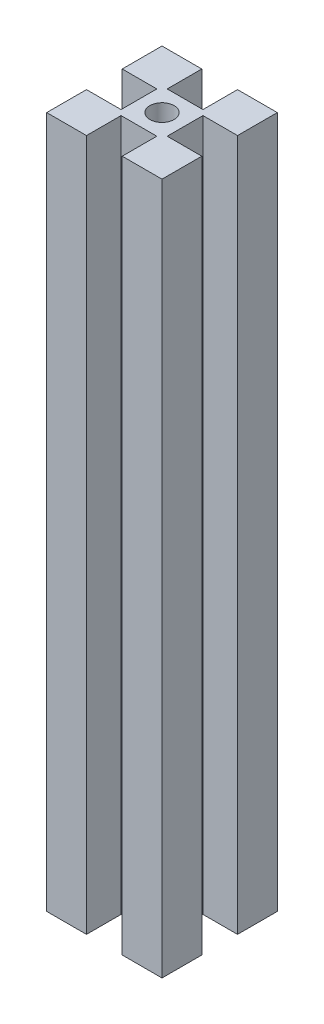
ISO-10303-21;
HEADER;
FILE_DESCRIPTION(('STEP AP214'),'2;1');
FILE_NAME('part.step','',(''),(''),'','','');
FILE_SCHEMA(('AUTOMOTIVE_DESIGN { 1 0 10303 214 1 1 1 1 }'));
ENDSEC;
DATA;
#1=APPLICATION_CONTEXT('core data for automotive mechanical design processes');
#2=APPLICATION_PROTOCOL_DEFINITION('international standard','automotive_design',2000,#1);
#3=PRODUCT_CONTEXT('',#1,'mechanical');
#4=PRODUCT('Part','Part','',(#3));
#5=PRODUCT_RELATED_PRODUCT_CATEGORY('part','',(#4));
#6=PRODUCT_DEFINITION_FORMATION('','',#4);
#7=PRODUCT_DEFINITION_CONTEXT('part definition',#1,'design');
#8=PRODUCT_DEFINITION('design','',#6,#7);
#9=PRODUCT_DEFINITION_SHAPE('','',#8);
#10=(LENGTH_UNIT() NAMED_UNIT(*) SI_UNIT(.MILLI.,.METRE.));
#11=(NAMED_UNIT(*) PLANE_ANGLE_UNIT() SI_UNIT($,.RADIAN.));
#12=(NAMED_UNIT(*) SI_UNIT($,.STERADIAN.) SOLID_ANGLE_UNIT());
#13=UNCERTAINTY_MEASURE_WITH_UNIT(LENGTH_MEASURE(1.E-05),#10,'distance_accuracy_value','');
#14=(GEOMETRIC_REPRESENTATION_CONTEXT(3) GLOBAL_UNCERTAINTY_ASSIGNED_CONTEXT((#13)) GLOBAL_UNIT_ASSIGNED_CONTEXT((#10,
#11,#12)) REPRESENTATION_CONTEXT('',''));
#15=CARTESIAN_POINT('',(0.,0.,0.));
#16=DIRECTION('',(0.,0.,1.));
#17=DIRECTION('',(1.,0.,0.));
#18=AXIS2_PLACEMENT_3D('',#15,#16,#17);
#19=CARTESIAN_POINT('',(0.,120.,0.));
#20=DIRECTION('',(0.,1.,0.));
#21=DIRECTION('',(0.,0.,1.));
#22=AXIS2_PLACEMENT_3D('',#19,#20,#21);
#23=PLANE('',#22);
#24=DIRECTION('',(1.,0.,0.));
#25=VECTOR('',#24,1.);
#26=CARTESIAN_POINT('',(3.1,120.,10.));
#27=LINE('',#26,#25);
#28=CARTESIAN_POINT('',(3.1,120.,10.));
#29=VERTEX_POINT('',#28);
#30=CARTESIAN_POINT('',(10.,120.,10.));
#31=VERTEX_POINT('',#30);
#32=EDGE_CURVE('E252',#29,#31,#27,.T.);
#33=ORIENTED_EDGE('',*,*,#32,.T.);
#34=DIRECTION('',(0.,0.,-1.));
#35=VECTOR('',#34,1.);
#36=CARTESIAN_POINT('',(10.,120.,10.));
#37=LINE('',#36,#35);
#38=CARTESIAN_POINT('',(10.,120.,3.1));
#39=VERTEX_POINT('',#38);
#40=EDGE_CURVE('E137',#31,#39,#37,.T.);
#41=ORIENTED_EDGE('',*,*,#40,.T.);
#42=DIRECTION('',(-1.,0.,0.));
#43=VECTOR('',#42,1.);
#44=CARTESIAN_POINT('',(10.,120.,3.1));
#45=LINE('',#44,#43);
#46=CARTESIAN_POINT('',(4.,120.,3.1));
#47=VERTEX_POINT('',#46);
#48=EDGE_CURVE('E302',#39,#47,#45,.T.);
#49=ORIENTED_EDGE('',*,*,#48,.T.);
#50=DIRECTION('',(0.,0.,-1.));
#51=VECTOR('',#50,1.);
#52=CARTESIAN_POINT('',(4.,120.,3.1));
#53=LINE('',#52,#51);
#54=CARTESIAN_POINT('',(4.,120.,-3.1));
#55=VERTEX_POINT('',#54);
#56=EDGE_CURVE('E321',#47,#55,#53,.T.);
#57=ORIENTED_EDGE('',*,*,#56,.T.);
#58=DIRECTION('',(1.,0.,0.));
#59=VECTOR('',#58,1.);
#60=CARTESIAN_POINT('',(4.,120.,-3.1));
#61=LINE('',#60,#59);
#62=CARTESIAN_POINT('',(10.,120.,-3.1));
#63=VERTEX_POINT('',#62);
#64=EDGE_CURVE('E318',#55,#63,#61,.T.);
#65=ORIENTED_EDGE('',*,*,#64,.T.);
#66=DIRECTION('',(0.,0.,-1.));
#67=VECTOR('',#66,1.);
#68=CARTESIAN_POINT('',(10.,120.,-3.1));
#69=LINE('',#68,#67);
#70=CARTESIAN_POINT('',(10.,120.,-10.));
#71=VERTEX_POINT('',#70);
#72=EDGE_CURVE('E319',#63,#71,#69,.T.);
#73=ORIENTED_EDGE('',*,*,#72,.T.);
#74=DIRECTION('',(-1.,0.,0.));
#75=VECTOR('',#74,1.);
#76=CARTESIAN_POINT('',(10.,120.,-10.));
#77=LINE('',#76,#75);
#78=CARTESIAN_POINT('',(3.1,120.,-10.));
#79=VERTEX_POINT('',#78);
#80=EDGE_CURVE('E322',#71,#79,#77,.T.);
#81=ORIENTED_EDGE('',*,*,#80,.T.);
#82=DIRECTION('',(0.,0.,1.));
#83=VECTOR('',#82,1.);
#84=CARTESIAN_POINT('',(3.1,120.,-10.));
#85=LINE('',#84,#83);
#86=CARTESIAN_POINT('',(3.1,120.,-4.));
#87=VERTEX_POINT('',#86);
#88=EDGE_CURVE('E326',#79,#87,#85,.T.);
#89=ORIENTED_EDGE('',*,*,#88,.T.);
#90=DIRECTION('',(-1.,0.,0.));
#91=VECTOR('',#90,1.);
#92=CARTESIAN_POINT('',(3.1,120.,-4.));
#93=LINE('',#92,#91);
#94=CARTESIAN_POINT('',(-3.1,120.,-4.));
#95=VERTEX_POINT('',#94);
#96=EDGE_CURVE('E332',#87,#95,#93,.T.);
#97=ORIENTED_EDGE('',*,*,#96,.T.);
#98=DIRECTION('',(0.,0.,-1.));
#99=VECTOR('',#98,1.);
#100=CARTESIAN_POINT('',(-3.1,120.,-4.));
#101=LINE('',#100,#99);
#102=CARTESIAN_POINT('',(-3.1,120.,-10.));
#103=VERTEX_POINT('',#102);
#104=EDGE_CURVE('E335',#95,#103,#101,.T.);
#105=ORIENTED_EDGE('',*,*,#104,.T.);
#106=DIRECTION('',(-1.,0.,0.));
#107=VECTOR('',#106,1.);
#108=CARTESIAN_POINT('',(-3.1,120.,-10.));
#109=LINE('',#108,#107);
#110=CARTESIAN_POINT('',(-10.,120.,-10.));
#111=VERTEX_POINT('',#110);
#112=EDGE_CURVE('E333',#103,#111,#109,.T.);
#113=ORIENTED_EDGE('',*,*,#112,.T.);
#114=DIRECTION('',(0.,0.,1.));
#115=VECTOR('',#114,1.);
#116=CARTESIAN_POINT('',(-10.,120.,-10.));
#117=LINE('',#116,#115);
#118=CARTESIAN_POINT('',(-10.,120.,-3.1));
#119=VERTEX_POINT('',#118);
#120=EDGE_CURVE('E340',#111,#119,#117,.T.);
#121=ORIENTED_EDGE('',*,*,#120,.T.);
#122=DIRECTION('',(1.,0.,0.));
#123=VECTOR('',#122,1.);
#124=CARTESIAN_POINT('',(-10.,120.,-3.1));
#125=LINE('',#124,#123);
#126=CARTESIAN_POINT('',(-4.,120.,-3.1));
#127=VERTEX_POINT('',#126);
#128=EDGE_CURVE('E339',#119,#127,#125,.T.);
#129=ORIENTED_EDGE('',*,*,#128,.T.);
#130=DIRECTION('',(0.,0.,1.));
#131=VECTOR('',#130,1.);
#132=CARTESIAN_POINT('',(-4.,120.,-3.1));
#133=LINE('',#132,#131);
#134=CARTESIAN_POINT('',(-4.,120.,3.1));
#135=VERTEX_POINT('',#134);
#136=EDGE_CURVE('E342',#127,#135,#133,.T.);
#137=ORIENTED_EDGE('',*,*,#136,.T.);
#138=DIRECTION('',(-1.,0.,0.));
#139=VECTOR('',#138,1.);
#140=CARTESIAN_POINT('',(-4.,120.,3.1));
#141=LINE('',#140,#139);
#142=CARTESIAN_POINT('',(-10.,120.,3.1));
#143=VERTEX_POINT('',#142);
#144=EDGE_CURVE('E345',#135,#143,#141,.T.);
#145=ORIENTED_EDGE('',*,*,#144,.T.);
#146=DIRECTION('',(0.,0.,1.));
#147=VECTOR('',#146,1.);
#148=CARTESIAN_POINT('',(-10.,120.,3.1));
#149=LINE('',#148,#147);
#150=CARTESIAN_POINT('',(-10.,120.,10.));
#151=VERTEX_POINT('',#150);
#152=EDGE_CURVE('E343',#143,#151,#149,.T.);
#153=ORIENTED_EDGE('',*,*,#152,.T.);
#154=DIRECTION('',(1.,0.,0.));
#155=VECTOR('',#154,1.);
#156=CARTESIAN_POINT('',(-10.,120.,10.));
#157=LINE('',#156,#155);
#158=CARTESIAN_POINT('',(-3.1,120.,10.));
#159=VERTEX_POINT('',#158);
#160=EDGE_CURVE('E191',#151,#159,#157,.T.);
#161=ORIENTED_EDGE('',*,*,#160,.T.);
#162=DIRECTION('',(0.,0.,-1.));
#163=VECTOR('',#162,1.);
#164=CARTESIAN_POINT('',(-3.1,120.,10.));
#165=LINE('',#164,#163);
#166=CARTESIAN_POINT('',(-3.1,120.,4.));
#167=VERTEX_POINT('',#166);
#168=EDGE_CURVE('E187',#159,#167,#165,.T.);
#169=ORIENTED_EDGE('',*,*,#168,.T.);
#170=DIRECTION('',(1.,0.,0.));
#171=VECTOR('',#170,1.);
#172=CARTESIAN_POINT('',(-3.1,120.,4.));
#173=LINE('',#172,#171);
#174=CARTESIAN_POINT('',(3.1,120.,4.));
#175=VERTEX_POINT('',#174);
#176=EDGE_CURVE('E195',#167,#175,#173,.T.);
#177=ORIENTED_EDGE('',*,*,#176,.T.);
#178=DIRECTION('',(0.,0.,1.));
#179=VECTOR('',#178,1.);
#180=CARTESIAN_POINT('',(3.1,120.,4.));
#181=LINE('',#180,#179);
#182=EDGE_CURVE('E58',#175,#29,#181,.T.);
#183=ORIENTED_EDGE('',*,*,#182,.T.);
#184=EDGE_LOOP('',(#33,#41,#49,#57,#65,#73,#81,#89,#97,#105,#113,#121,#129,#137,#145,#153,#161,
#169,#177,#183));
#185=FACE_BOUND('',#184,.T.);
#186=CARTESIAN_POINT('',(0.,120.,0.));
#187=DIRECTION('',(0.,1.,0.));
#188=DIRECTION('',(0.,0.,1.));
#189=AXIS2_PLACEMENT_3D('',#186,#187,#188);
#190=CIRCLE('',#189,2.1);
#191=CARTESIAN_POINT('',(0.,120.,2.1));
#192=VERTEX_POINT('',#191);
#193=EDGE_CURVE('E218',#192,#192,#190,.T.);
#194=ORIENTED_EDGE('',*,*,#193,.F.);
#195=EDGE_LOOP('',(#194));
#196=FACE_BOUND('',#195,.T.);
#197=ADVANCED_FACE('F43',(#185,#196),#23,.T.);
#198=CARTESIAN_POINT('',(0.,0.,0.));
#199=DIRECTION('',(0.,1.,0.));
#200=DIRECTION('',(0.,0.,1.));
#201=AXIS2_PLACEMENT_3D('',#198,#199,#200);
#202=PLANE('',#201);
#203=DIRECTION('',(1.,0.,0.));
#204=VECTOR('',#203,1.);
#205=CARTESIAN_POINT('',(3.1,0.,10.));
#206=LINE('',#205,#204);
#207=CARTESIAN_POINT('',(3.1,0.,10.));
#208=VERTEX_POINT('',#207);
#209=CARTESIAN_POINT('',(10.,0.,10.));
#210=VERTEX_POINT('',#209);
#211=EDGE_CURVE('E212',#208,#210,#206,.T.);
#212=ORIENTED_EDGE('',*,*,#211,.F.);
#213=DIRECTION('',(0.,0.,1.));
#214=VECTOR('',#213,1.);
#215=CARTESIAN_POINT('',(3.1,0.,4.));
#216=LINE('',#215,#214);
#217=CARTESIAN_POINT('',(3.1,0.,4.));
#218=VERTEX_POINT('',#217);
#219=EDGE_CURVE('E131',#218,#208,#216,.T.);
#220=ORIENTED_EDGE('',*,*,#219,.F.);
#221=DIRECTION('',(1.,0.,0.));
#222=VECTOR('',#221,1.);
#223=CARTESIAN_POINT('',(-3.1,0.,4.));
#224=LINE('',#223,#222);
#225=CARTESIAN_POINT('',(-3.1,0.,4.));
#226=VERTEX_POINT('',#225);
#227=EDGE_CURVE('E124',#226,#218,#224,.T.);
#228=ORIENTED_EDGE('',*,*,#227,.F.);
#229=DIRECTION('',(0.,0.,-1.));
#230=VECTOR('',#229,1.);
#231=CARTESIAN_POINT('',(-3.1,0.,10.));
#232=LINE('',#231,#230);
#233=CARTESIAN_POINT('',(-3.1,0.,10.));
#234=VERTEX_POINT('',#233);
#235=EDGE_CURVE('E205',#234,#226,#232,.T.);
#236=ORIENTED_EDGE('',*,*,#235,.F.);
#237=DIRECTION('',(1.,0.,0.));
#238=VECTOR('',#237,1.);
#239=CARTESIAN_POINT('',(-10.,0.,10.));
#240=LINE('',#239,#238);
#241=CARTESIAN_POINT('',(-10.,0.,10.));
#242=VERTEX_POINT('',#241);
#243=EDGE_CURVE('E247',#242,#234,#240,.T.);
#244=ORIENTED_EDGE('',*,*,#243,.F.);
#245=DIRECTION('',(0.,0.,1.));
#246=VECTOR('',#245,1.);
#247=CARTESIAN_POINT('',(-10.,0.,3.1));
#248=LINE('',#247,#246);
#249=CARTESIAN_POINT('',(-10.,0.,3.1));
#250=VERTEX_POINT('',#249);
#251=EDGE_CURVE('E241',#250,#242,#248,.T.);
#252=ORIENTED_EDGE('',*,*,#251,.F.);
#253=DIRECTION('',(-1.,0.,0.));
#254=VECTOR('',#253,1.);
#255=CARTESIAN_POINT('',(-4.,0.,3.1));
#256=LINE('',#255,#254);
#257=CARTESIAN_POINT('',(-4.,0.,3.1));
#258=VERTEX_POINT('',#257);
#259=EDGE_CURVE('E244',#258,#250,#256,.T.);
#260=ORIENTED_EDGE('',*,*,#259,.F.);
#261=DIRECTION('',(0.,0.,1.));
#262=VECTOR('',#261,1.);
#263=CARTESIAN_POINT('',(-4.,0.,-3.1));
#264=LINE('',#263,#262);
#265=CARTESIAN_POINT('',(-4.,0.,-3.1));
#266=VERTEX_POINT('',#265);
#267=EDGE_CURVE('E238',#266,#258,#264,.T.);
#268=ORIENTED_EDGE('',*,*,#267,.F.);
#269=DIRECTION('',(1.,0.,0.));
#270=VECTOR('',#269,1.);
#271=CARTESIAN_POINT('',(-10.,0.,-3.1));
#272=LINE('',#271,#270);
#273=CARTESIAN_POINT('',(-10.,0.,-3.1));
#274=VERTEX_POINT('',#273);
#275=EDGE_CURVE('E239',#274,#266,#272,.T.);
#276=ORIENTED_EDGE('',*,*,#275,.F.);
#277=DIRECTION('',(0.,0.,1.));
#278=VECTOR('',#277,1.);
#279=CARTESIAN_POINT('',(-10.,0.,-10.));
#280=LINE('',#279,#278);
#281=CARTESIAN_POINT('',(-10.,0.,-10.));
#282=VERTEX_POINT('',#281);
#283=EDGE_CURVE('E237',#282,#274,#280,.T.);
#284=ORIENTED_EDGE('',*,*,#283,.F.);
#285=DIRECTION('',(-1.,0.,0.));
#286=VECTOR('',#285,1.);
#287=CARTESIAN_POINT('',(-3.1,0.,-10.));
#288=LINE('',#287,#286);
#289=CARTESIAN_POINT('',(-3.1,0.,-10.));
#290=VERTEX_POINT('',#289);
#291=EDGE_CURVE('E233',#290,#282,#288,.T.);
#292=ORIENTED_EDGE('',*,*,#291,.F.);
#293=DIRECTION('',(0.,0.,-1.));
#294=VECTOR('',#293,1.);
#295=CARTESIAN_POINT('',(-3.1,0.,-4.));
#296=LINE('',#295,#294);
#297=CARTESIAN_POINT('',(-3.1,0.,-4.));
#298=VERTEX_POINT('',#297);
#299=EDGE_CURVE('E235',#298,#290,#296,.T.);
#300=ORIENTED_EDGE('',*,*,#299,.F.);
#301=DIRECTION('',(-1.,0.,0.));
#302=VECTOR('',#301,1.);
#303=CARTESIAN_POINT('',(3.1,0.,-4.));
#304=LINE('',#303,#302);
#305=CARTESIAN_POINT('',(3.1,0.,-4.));
#306=VERTEX_POINT('',#305);
#307=EDGE_CURVE('E229',#306,#298,#304,.T.);
#308=ORIENTED_EDGE('',*,*,#307,.F.);
#309=DIRECTION('',(0.,0.,1.));
#310=VECTOR('',#309,1.);
#311=CARTESIAN_POINT('',(3.1,0.,-10.));
#312=LINE('',#311,#310);
#313=CARTESIAN_POINT('',(3.1,0.,-10.));
#314=VERTEX_POINT('',#313);
#315=EDGE_CURVE('E228',#314,#306,#312,.T.);
#316=ORIENTED_EDGE('',*,*,#315,.F.);
#317=DIRECTION('',(-1.,0.,0.));
#318=VECTOR('',#317,1.);
#319=CARTESIAN_POINT('',(10.,0.,-10.));
#320=LINE('',#319,#318);
#321=CARTESIAN_POINT('',(10.,0.,-10.));
#322=VERTEX_POINT('',#321);
#323=EDGE_CURVE('E226',#322,#314,#320,.T.);
#324=ORIENTED_EDGE('',*,*,#323,.F.);
#325=DIRECTION('',(0.,0.,-1.));
#326=VECTOR('',#325,1.);
#327=CARTESIAN_POINT('',(10.,0.,-3.1));
#328=LINE('',#327,#326);
#329=CARTESIAN_POINT('',(10.,0.,-3.1));
#330=VERTEX_POINT('',#329);
#331=EDGE_CURVE('E222',#330,#322,#328,.T.);
#332=ORIENTED_EDGE('',*,*,#331,.F.);
#333=DIRECTION('',(1.,0.,0.));
#334=VECTOR('',#333,1.);
#335=CARTESIAN_POINT('',(4.,0.,-3.1));
#336=LINE('',#335,#334);
#337=CARTESIAN_POINT('',(4.,0.,-3.1));
#338=VERTEX_POINT('',#337);
#339=EDGE_CURVE('E225',#338,#330,#336,.T.);
#340=ORIENTED_EDGE('',*,*,#339,.F.);
#341=DIRECTION('',(0.,0.,-1.));
#342=VECTOR('',#341,1.);
#343=CARTESIAN_POINT('',(4.,0.,3.1));
#344=LINE('',#343,#342);
#345=CARTESIAN_POINT('',(4.,0.,3.1));
#346=VERTEX_POINT('',#345);
#347=EDGE_CURVE('E217',#346,#338,#344,.T.);
#348=ORIENTED_EDGE('',*,*,#347,.F.);
#349=DIRECTION('',(-1.,0.,0.));
#350=VECTOR('',#349,1.);
#351=CARTESIAN_POINT('',(10.,0.,3.1));
#352=LINE('',#351,#350);
#353=CARTESIAN_POINT('',(10.,0.,3.1));
#354=VERTEX_POINT('',#353);
#355=EDGE_CURVE('E216',#354,#346,#352,.T.);
#356=ORIENTED_EDGE('',*,*,#355,.F.);
#357=DIRECTION('',(0.,0.,-1.));
#358=VECTOR('',#357,1.);
#359=CARTESIAN_POINT('',(10.,0.,10.));
#360=LINE('',#359,#358);
#361=EDGE_CURVE('E214',#210,#354,#360,.T.);
#362=ORIENTED_EDGE('',*,*,#361,.F.);
#363=EDGE_LOOP('',(#212,#220,#228,#236,#244,#252,#260,#268,#276,#284,#292,#300,#308,#316,#324,
#332,#340,#348,#356,#362));
#364=FACE_BOUND('',#363,.T.);
#365=CARTESIAN_POINT('',(0.,0.,0.));
#366=DIRECTION('',(0.,1.,0.));
#367=DIRECTION('',(0.,0.,1.));
#368=AXIS2_PLACEMENT_3D('',#365,#366,#367);
#369=CIRCLE('',#368,2.1);
#370=CARTESIAN_POINT('',(0.,0.,2.1));
#371=VERTEX_POINT('',#370);
#372=EDGE_CURVE('E689',#371,#371,#369,.T.);
#373=ORIENTED_EDGE('',*,*,#372,.T.);
#374=EDGE_LOOP('',(#373));
#375=FACE_BOUND('',#374,.T.);
#376=ADVANCED_FACE('F308',(#364,#375),#202,.F.);
#377=CARTESIAN_POINT('',(3.1,120.,10.));
#378=DIRECTION('',(0.,0.,-1.));
#379=DIRECTION('',(-1.,0.,0.));
#380=AXIS2_PLACEMENT_3D('',#377,#378,#379);
#381=PLANE('',#380);
#382=ORIENTED_EDGE('',*,*,#211,.T.);
#383=DIRECTION('',(0.,-1.,0.));
#384=VECTOR('',#383,1.);
#385=CARTESIAN_POINT('',(10.,120.,10.));
#386=LINE('',#385,#384);
#387=EDGE_CURVE('E11',#31,#210,#386,.T.);
#388=ORIENTED_EDGE('',*,*,#387,.F.);
#389=ORIENTED_EDGE('',*,*,#32,.F.);
#390=DIRECTION('',(0.,-1.,0.));
#391=VECTOR('',#390,1.);
#392=CARTESIAN_POINT('',(3.1,120.,10.));
#393=LINE('',#392,#391);
#394=EDGE_CURVE('E210',#29,#208,#393,.T.);
#395=ORIENTED_EDGE('',*,*,#394,.T.);
#396=EDGE_LOOP('',(#382,#388,#389,#395));
#397=FACE_BOUND('',#396,.T.);
#398=ADVANCED_FACE('F44',(#397),#381,.F.);
#399=CARTESIAN_POINT('',(10.,120.,10.));
#400=DIRECTION('',(-1.,0.,0.));
#401=DIRECTION('',(0.,0.,1.));
#402=AXIS2_PLACEMENT_3D('',#399,#400,#401);
#403=PLANE('',#402);
#404=ORIENTED_EDGE('',*,*,#361,.T.);
#405=DIRECTION('',(0.,-1.,0.));
#406=VECTOR('',#405,1.);
#407=CARTESIAN_POINT('',(10.,120.,3.1));
#408=LINE('',#407,#406);
#409=EDGE_CURVE('E55',#39,#354,#408,.T.);
#410=ORIENTED_EDGE('',*,*,#409,.F.);
#411=ORIENTED_EDGE('',*,*,#40,.F.);
#412=ORIENTED_EDGE('',*,*,#387,.T.);
#413=EDGE_LOOP('',(#404,#410,#411,#412));
#414=FACE_BOUND('',#413,.T.);
#415=ADVANCED_FACE('F376',(#414),#403,.F.);
#416=CARTESIAN_POINT('',(10.,120.,3.1));
#417=DIRECTION('',(0.,0.,1.));
#418=DIRECTION('',(1.,0.,0.));
#419=AXIS2_PLACEMENT_3D('',#416,#417,#418);
#420=PLANE('',#419);
#421=ORIENTED_EDGE('',*,*,#355,.T.);
#422=DIRECTION('',(0.,-1.,0.));
#423=VECTOR('',#422,1.);
#424=CARTESIAN_POINT('',(4.,120.,3.1));
#425=LINE('',#424,#423);
#426=EDGE_CURVE('E294',#47,#346,#425,.T.);
#427=ORIENTED_EDGE('',*,*,#426,.F.);
#428=ORIENTED_EDGE('',*,*,#48,.F.);
#429=ORIENTED_EDGE('',*,*,#409,.T.);
#430=EDGE_LOOP('',(#421,#427,#428,#429));
#431=FACE_BOUND('',#430,.T.);
#432=ADVANCED_FACE('F298',(#431),#420,.F.);
#433=CARTESIAN_POINT('',(4.,120.,3.1));
#434=DIRECTION('',(-1.,0.,0.));
#435=DIRECTION('',(0.,0.,1.));
#436=AXIS2_PLACEMENT_3D('',#433,#434,#435);
#437=PLANE('',#436);
#438=ORIENTED_EDGE('',*,*,#347,.T.);
#439=DIRECTION('',(0.,-1.,0.));
#440=VECTOR('',#439,1.);
#441=CARTESIAN_POINT('',(4.,120.,-3.1));
#442=LINE('',#441,#440);
#443=EDGE_CURVE('E292',#55,#338,#442,.T.);
#444=ORIENTED_EDGE('',*,*,#443,.F.);
#445=ORIENTED_EDGE('',*,*,#56,.F.);
#446=ORIENTED_EDGE('',*,*,#426,.T.);
#447=EDGE_LOOP('',(#438,#444,#445,#446));
#448=FACE_BOUND('',#447,.T.);
#449=ADVANCED_FACE('F315',(#448),#437,.F.);
#450=CARTESIAN_POINT('',(4.,120.,-3.1));
#451=DIRECTION('',(0.,0.,-1.));
#452=DIRECTION('',(-1.,0.,0.));
#453=AXIS2_PLACEMENT_3D('',#450,#451,#452);
#454=PLANE('',#453);
#455=ORIENTED_EDGE('',*,*,#339,.T.);
#456=DIRECTION('',(0.,-1.,0.));
#457=VECTOR('',#456,1.);
#458=CARTESIAN_POINT('',(10.,120.,-3.1));
#459=LINE('',#458,#457);
#460=EDGE_CURVE('E290',#63,#330,#459,.T.);
#461=ORIENTED_EDGE('',*,*,#460,.F.);
#462=ORIENTED_EDGE('',*,*,#64,.F.);
#463=ORIENTED_EDGE('',*,*,#443,.T.);
#464=EDGE_LOOP('',(#455,#461,#462,#463));
#465=FACE_BOUND('',#464,.T.);
#466=ADVANCED_FACE('F316',(#465),#454,.F.);
#467=CARTESIAN_POINT('',(10.,120.,-3.1));
#468=DIRECTION('',(-1.,0.,0.));
#469=DIRECTION('',(0.,0.,1.));
#470=AXIS2_PLACEMENT_3D('',#467,#468,#469);
#471=PLANE('',#470);
#472=ORIENTED_EDGE('',*,*,#331,.T.);
#473=DIRECTION('',(0.,-1.,0.));
#474=VECTOR('',#473,1.);
#475=CARTESIAN_POINT('',(10.,120.,-10.));
#476=LINE('',#475,#474);
#477=EDGE_CURVE('E283',#71,#322,#476,.T.);
#478=ORIENTED_EDGE('',*,*,#477,.F.);
#479=ORIENTED_EDGE('',*,*,#72,.F.);
#480=ORIENTED_EDGE('',*,*,#460,.T.);
#481=EDGE_LOOP('',(#472,#478,#479,#480));
#482=FACE_BOUND('',#481,.T.);
#483=ADVANCED_FACE('F392',(#482),#471,.F.);
#484=CARTESIAN_POINT('',(10.,120.,-10.));
#485=DIRECTION('',(0.,0.,1.));
#486=DIRECTION('',(1.,0.,0.));
#487=AXIS2_PLACEMENT_3D('',#484,#485,#486);
#488=PLANE('',#487);
#489=ORIENTED_EDGE('',*,*,#323,.T.);
#490=DIRECTION('',(0.,-1.,0.));
#491=VECTOR('',#490,1.);
#492=CARTESIAN_POINT('',(3.1,120.,-10.));
#493=LINE('',#492,#491);
#494=EDGE_CURVE('E285',#79,#314,#493,.T.);
#495=ORIENTED_EDGE('',*,*,#494,.F.);
#496=ORIENTED_EDGE('',*,*,#80,.F.);
#497=ORIENTED_EDGE('',*,*,#477,.T.);
#498=EDGE_LOOP('',(#489,#495,#496,#497));
#499=FACE_BOUND('',#498,.T.);
#500=ADVANCED_FACE('F394',(#499),#488,.F.);
#501=CARTESIAN_POINT('',(3.1,120.,-10.));
#502=DIRECTION('',(1.,0.,0.));
#503=DIRECTION('',(0.,0.,-1.));
#504=AXIS2_PLACEMENT_3D('',#501,#502,#503);
#505=PLANE('',#504);
#506=ORIENTED_EDGE('',*,*,#315,.T.);
#507=DIRECTION('',(0.,-1.,0.));
#508=VECTOR('',#507,1.);
#509=CARTESIAN_POINT('',(3.1,120.,-4.));
#510=LINE('',#509,#508);
#511=EDGE_CURVE('E278',#87,#306,#510,.T.);
#512=ORIENTED_EDGE('',*,*,#511,.F.);
#513=ORIENTED_EDGE('',*,*,#88,.F.);
#514=ORIENTED_EDGE('',*,*,#494,.T.);
#515=EDGE_LOOP('',(#506,#512,#513,#514));
#516=FACE_BOUND('',#515,.T.);
#517=ADVANCED_FACE('F399',(#516),#505,.F.);
#518=CARTESIAN_POINT('',(3.1,120.,-4.));
#519=DIRECTION('',(0.,0.,1.));
#520=DIRECTION('',(1.,0.,0.));
#521=AXIS2_PLACEMENT_3D('',#518,#519,#520);
#522=PLANE('',#521);
#523=ORIENTED_EDGE('',*,*,#307,.T.);
#524=DIRECTION('',(0.,-1.,0.));
#525=VECTOR('',#524,1.);
#526=CARTESIAN_POINT('',(-3.1,120.,-4.));
#527=LINE('',#526,#525);
#528=EDGE_CURVE('E276',#95,#298,#527,.T.);
#529=ORIENTED_EDGE('',*,*,#528,.F.);
#530=ORIENTED_EDGE('',*,*,#96,.F.);
#531=ORIENTED_EDGE('',*,*,#511,.T.);
#532=EDGE_LOOP('',(#523,#529,#530,#531));
#533=FACE_BOUND('',#532,.T.);
#534=ADVANCED_FACE('F403',(#533),#522,.F.);
#535=CARTESIAN_POINT('',(-3.1,120.,-4.));
#536=DIRECTION('',(-1.,0.,0.));
#537=DIRECTION('',(0.,0.,1.));
#538=AXIS2_PLACEMENT_3D('',#535,#536,#537);
#539=PLANE('',#538);
#540=ORIENTED_EDGE('',*,*,#299,.T.);
#541=DIRECTION('',(0.,-1.,0.));
#542=VECTOR('',#541,1.);
#543=CARTESIAN_POINT('',(-3.1,120.,-10.));
#544=LINE('',#543,#542);
#545=EDGE_CURVE('E273',#103,#290,#544,.T.);
#546=ORIENTED_EDGE('',*,*,#545,.F.);
#547=ORIENTED_EDGE('',*,*,#104,.F.);
#548=ORIENTED_EDGE('',*,*,#528,.T.);
#549=EDGE_LOOP('',(#540,#546,#547,#548));
#550=FACE_BOUND('',#549,.T.);
#551=ADVANCED_FACE('F410',(#550),#539,.F.);
#552=CARTESIAN_POINT('',(-3.1,120.,-10.));
#553=DIRECTION('',(0.,0.,1.));
#554=DIRECTION('',(1.,0.,0.));
#555=AXIS2_PLACEMENT_3D('',#552,#553,#554);
#556=PLANE('',#555);
#557=ORIENTED_EDGE('',*,*,#291,.T.);
#558=DIRECTION('',(0.,-1.,0.));
#559=VECTOR('',#558,1.);
#560=CARTESIAN_POINT('',(-10.,120.,-10.));
#561=LINE('',#560,#559);
#562=EDGE_CURVE('E269',#111,#282,#561,.T.);
#563=ORIENTED_EDGE('',*,*,#562,.F.);
#564=ORIENTED_EDGE('',*,*,#112,.F.);
#565=ORIENTED_EDGE('',*,*,#545,.T.);
#566=EDGE_LOOP('',(#557,#563,#564,#565));
#567=FACE_BOUND('',#566,.T.);
#568=ADVANCED_FACE('F411',(#567),#556,.F.);
#569=CARTESIAN_POINT('',(-10.,120.,-10.));
#570=DIRECTION('',(1.,0.,0.));
#571=DIRECTION('',(0.,0.,-1.));
#572=AXIS2_PLACEMENT_3D('',#569,#570,#571);
#573=PLANE('',#572);
#574=ORIENTED_EDGE('',*,*,#283,.T.);
#575=DIRECTION('',(0.,-1.,0.));
#576=VECTOR('',#575,1.);
#577=CARTESIAN_POINT('',(-10.,120.,-3.1));
#578=LINE('',#577,#576);
#579=EDGE_CURVE('E270',#119,#274,#578,.T.);
#580=ORIENTED_EDGE('',*,*,#579,.F.);
#581=ORIENTED_EDGE('',*,*,#120,.F.);
#582=ORIENTED_EDGE('',*,*,#562,.T.);
#583=EDGE_LOOP('',(#574,#580,#581,#582));
#584=FACE_BOUND('',#583,.T.);
#585=ADVANCED_FACE('F414',(#584),#573,.F.);
#586=CARTESIAN_POINT('',(-10.,120.,-3.1));
#587=DIRECTION('',(0.,0.,-1.));
#588=DIRECTION('',(-1.,0.,0.));
#589=AXIS2_PLACEMENT_3D('',#586,#587,#588);
#590=PLANE('',#589);
#591=ORIENTED_EDGE('',*,*,#275,.T.);
#592=DIRECTION('',(0.,-1.,0.));
#593=VECTOR('',#592,1.);
#594=CARTESIAN_POINT('',(-4.,120.,-3.1));
#595=LINE('',#594,#593);
#596=EDGE_CURVE('E264',#127,#266,#595,.T.);
#597=ORIENTED_EDGE('',*,*,#596,.F.);
#598=ORIENTED_EDGE('',*,*,#128,.F.);
#599=ORIENTED_EDGE('',*,*,#579,.T.);
#600=EDGE_LOOP('',(#591,#597,#598,#599));
#601=FACE_BOUND('',#600,.T.);
#602=ADVANCED_FACE('F416',(#601),#590,.F.);
#603=CARTESIAN_POINT('',(-4.,120.,-3.1));
#604=DIRECTION('',(1.,0.,0.));
#605=DIRECTION('',(0.,0.,-1.));
#606=AXIS2_PLACEMENT_3D('',#603,#604,#605);
#607=PLANE('',#606);
#608=ORIENTED_EDGE('',*,*,#267,.T.);
#609=DIRECTION('',(0.,-1.,0.));
#610=VECTOR('',#609,1.);
#611=CARTESIAN_POINT('',(-4.,120.,3.1));
#612=LINE('',#611,#610);
#613=EDGE_CURVE('E263',#135,#258,#612,.T.);
#614=ORIENTED_EDGE('',*,*,#613,.F.);
#615=ORIENTED_EDGE('',*,*,#136,.F.);
#616=ORIENTED_EDGE('',*,*,#596,.T.);
#617=EDGE_LOOP('',(#608,#614,#615,#616));
#618=FACE_BOUND('',#617,.T.);
#619=ADVANCED_FACE('F425',(#618),#607,.F.);
#620=CARTESIAN_POINT('',(-4.,120.,3.1));
#621=DIRECTION('',(0.,0.,1.));
#622=DIRECTION('',(1.,0.,0.));
#623=AXIS2_PLACEMENT_3D('',#620,#621,#622);
#624=PLANE('',#623);
#625=ORIENTED_EDGE('',*,*,#259,.T.);
#626=DIRECTION('',(0.,-1.,0.));
#627=VECTOR('',#626,1.);
#628=CARTESIAN_POINT('',(-10.,120.,3.1));
#629=LINE('',#628,#627);
#630=EDGE_CURVE('E256',#143,#250,#629,.T.);
#631=ORIENTED_EDGE('',*,*,#630,.F.);
#632=ORIENTED_EDGE('',*,*,#144,.F.);
#633=ORIENTED_EDGE('',*,*,#613,.T.);
#634=EDGE_LOOP('',(#625,#631,#632,#633));
#635=FACE_BOUND('',#634,.T.);
#636=ADVANCED_FACE('F430',(#635),#624,.F.);
#637=CARTESIAN_POINT('',(-10.,120.,3.1));
#638=DIRECTION('',(1.,0.,0.));
#639=DIRECTION('',(0.,0.,-1.));
#640=AXIS2_PLACEMENT_3D('',#637,#638,#639);
#641=PLANE('',#640);
#642=ORIENTED_EDGE('',*,*,#251,.T.);
#643=DIRECTION('',(0.,-1.,0.));
#644=VECTOR('',#643,1.);
#645=CARTESIAN_POINT('',(-10.,120.,10.));
#646=LINE('',#645,#644);
#647=EDGE_CURVE('E253',#151,#242,#646,.T.);
#648=ORIENTED_EDGE('',*,*,#647,.F.);
#649=ORIENTED_EDGE('',*,*,#152,.F.);
#650=ORIENTED_EDGE('',*,*,#630,.T.);
#651=EDGE_LOOP('',(#642,#648,#649,#650));
#652=FACE_BOUND('',#651,.T.);
#653=ADVANCED_FACE('F353',(#652),#641,.F.);
#654=CARTESIAN_POINT('',(-10.,120.,10.));
#655=DIRECTION('',(0.,0.,-1.));
#656=DIRECTION('',(-1.,0.,0.));
#657=AXIS2_PLACEMENT_3D('',#654,#655,#656);
#658=PLANE('',#657);
#659=ORIENTED_EDGE('',*,*,#243,.T.);
#660=DIRECTION('',(0.,-1.,0.));
#661=VECTOR('',#660,1.);
#662=CARTESIAN_POINT('',(-3.1,120.,10.));
#663=LINE('',#662,#661);
#664=EDGE_CURVE('E201',#159,#234,#663,.T.);
#665=ORIENTED_EDGE('',*,*,#664,.F.);
#666=ORIENTED_EDGE('',*,*,#160,.F.);
#667=ORIENTED_EDGE('',*,*,#647,.T.);
#668=EDGE_LOOP('',(#659,#665,#666,#667));
#669=FACE_BOUND('',#668,.T.);
#670=ADVANCED_FACE('F352',(#669),#658,.F.);
#671=CARTESIAN_POINT('',(-3.1,120.,10.));
#672=DIRECTION('',(-1.,0.,0.));
#673=DIRECTION('',(0.,0.,1.));
#674=AXIS2_PLACEMENT_3D('',#671,#672,#673);
#675=PLANE('',#674);
#676=ORIENTED_EDGE('',*,*,#235,.T.);
#677=DIRECTION('',(0.,-1.,0.));
#678=VECTOR('',#677,1.);
#679=CARTESIAN_POINT('',(-3.1,120.,4.));
#680=LINE('',#679,#678);
#681=EDGE_CURVE('E196',#167,#226,#680,.T.);
#682=ORIENTED_EDGE('',*,*,#681,.F.);
#683=ORIENTED_EDGE('',*,*,#168,.F.);
#684=ORIENTED_EDGE('',*,*,#664,.T.);
#685=EDGE_LOOP('',(#676,#682,#683,#684));
#686=FACE_BOUND('',#685,.T.);
#687=ADVANCED_FACE('F198',(#686),#675,.F.);
#688=CARTESIAN_POINT('',(-3.1,120.,4.));
#689=DIRECTION('',(0.,0.,-1.));
#690=DIRECTION('',(-1.,0.,0.));
#691=AXIS2_PLACEMENT_3D('',#688,#689,#690);
#692=PLANE('',#691);
#693=ORIENTED_EDGE('',*,*,#227,.T.);
#694=DIRECTION('',(0.,-1.,0.));
#695=VECTOR('',#694,1.);
#696=CARTESIAN_POINT('',(3.1,120.,4.));
#697=LINE('',#696,#695);
#698=EDGE_CURVE('E204',#175,#218,#697,.T.);
#699=ORIENTED_EDGE('',*,*,#698,.F.);
#700=ORIENTED_EDGE('',*,*,#176,.F.);
#701=ORIENTED_EDGE('',*,*,#681,.T.);
#702=EDGE_LOOP('',(#693,#699,#700,#701));
#703=FACE_BOUND('',#702,.T.);
#704=ADVANCED_FACE('F207',(#703),#692,.F.);
#705=CARTESIAN_POINT('',(3.1,120.,4.));
#706=DIRECTION('',(1.,0.,0.));
#707=DIRECTION('',(0.,0.,-1.));
#708=AXIS2_PLACEMENT_3D('',#705,#706,#707);
#709=PLANE('',#708);
#710=ORIENTED_EDGE('',*,*,#219,.T.);
#711=ORIENTED_EDGE('',*,*,#394,.F.);
#712=ORIENTED_EDGE('',*,*,#182,.F.);
#713=ORIENTED_EDGE('',*,*,#698,.T.);
#714=EDGE_LOOP('',(#710,#711,#712,#713));
#715=FACE_BOUND('',#714,.T.);
#716=ADVANCED_FACE('F357',(#715),#709,.F.);
#717=CARTESIAN_POINT('',(0.,120.,0.));
#718=DIRECTION('',(0.,-1.,0.));
#719=DIRECTION('',(0.,0.,-1.));
#720=AXIS2_PLACEMENT_3D('',#717,#718,#719);
#721=CYLINDRICAL_SURFACE('',#720,2.1);
#722=ORIENTED_EDGE('',*,*,#193,.T.);
#723=EDGE_LOOP('',(#722));
#724=FACE_BOUND('',#723,.T.);
#725=ORIENTED_EDGE('',*,*,#372,.F.);
#726=EDGE_LOOP('',(#725));
#727=FACE_BOUND('',#726,.T.);
#728=ADVANCED_FACE('F361',(#724,#727),#721,.F.);
#729=CLOSED_SHELL('',(#197,#376,#398,#415,#432,#449,#466,#483,#500,#517,#534,#551,#568,#585,
#602,#619,#636,#653,#670,#687,#704,#716,#728));
#730=MANIFOLD_SOLID_BREP('B2',#729);
#731=ADVANCED_BREP_SHAPE_REPRESENTATION('',(#18,#730),#14);
#732=SHAPE_DEFINITION_REPRESENTATION(#9,#731);
ENDSEC;
END-ISO-10303-21;
